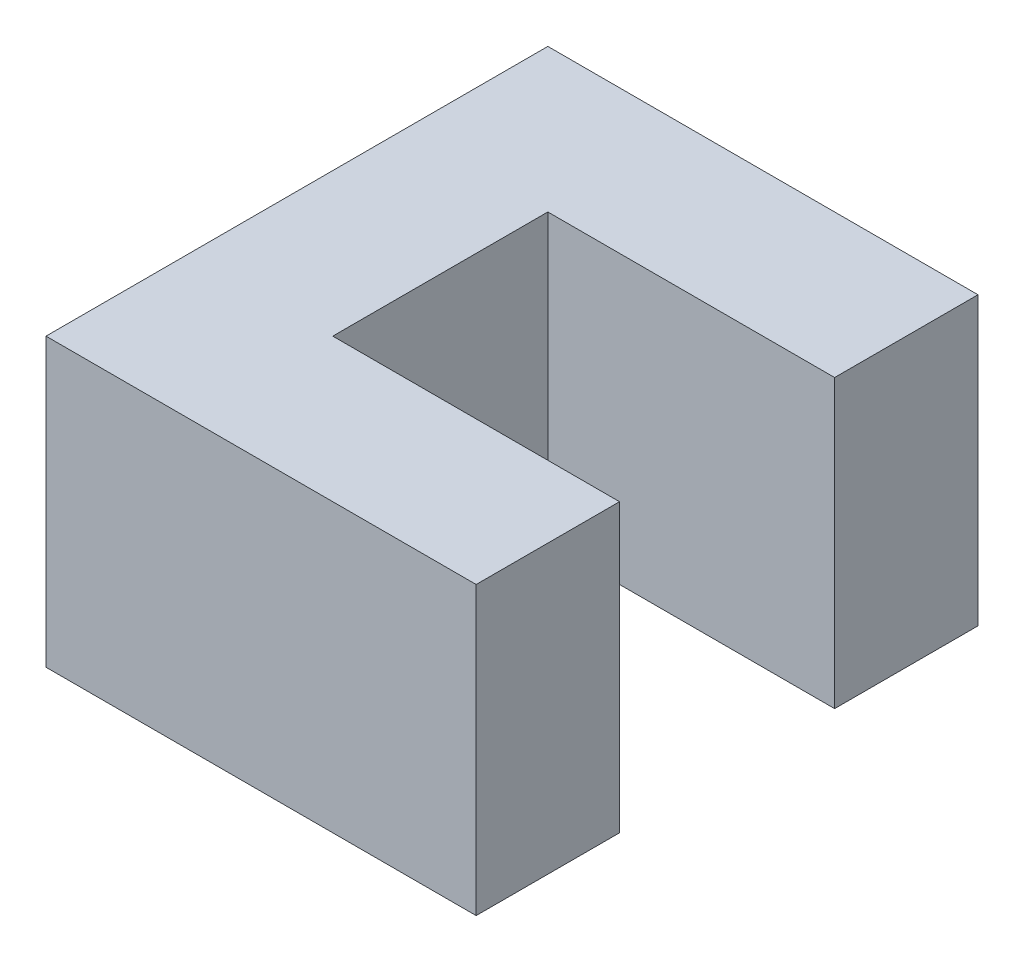
ISO-10303-21;
HEADER;
FILE_DESCRIPTION(('STEP AP214'),'2;1');
FILE_NAME('part.step','',(''),(''),'','','');
FILE_SCHEMA(('AUTOMOTIVE_DESIGN { 1 0 10303 214 1 1 1 1 }'));
ENDSEC;
DATA;
#1=APPLICATION_CONTEXT('core data for automotive mechanical design processes');
#2=APPLICATION_PROTOCOL_DEFINITION('international standard','automotive_design',2000,#1);
#3=PRODUCT_CONTEXT('',#1,'mechanical');
#4=PRODUCT('Part','Part','',(#3));
#5=PRODUCT_RELATED_PRODUCT_CATEGORY('part','',(#4));
#6=PRODUCT_DEFINITION_FORMATION('','',#4);
#7=PRODUCT_DEFINITION_CONTEXT('part definition',#1,'design');
#8=PRODUCT_DEFINITION('design','',#6,#7);
#9=PRODUCT_DEFINITION_SHAPE('','',#8);
#10=(LENGTH_UNIT() NAMED_UNIT(*) SI_UNIT(.MILLI.,.METRE.));
#11=(NAMED_UNIT(*) PLANE_ANGLE_UNIT() SI_UNIT($,.RADIAN.));
#12=(NAMED_UNIT(*) SI_UNIT($,.STERADIAN.) SOLID_ANGLE_UNIT());
#13=UNCERTAINTY_MEASURE_WITH_UNIT(LENGTH_MEASURE(1.E-05),#10,'distance_accuracy_value','');
#14=(GEOMETRIC_REPRESENTATION_CONTEXT(3) GLOBAL_UNCERTAINTY_ASSIGNED_CONTEXT((#13)) GLOBAL_UNIT_ASSIGNED_CONTEXT((#10,
#11,#12)) REPRESENTATION_CONTEXT('',''));
#15=CARTESIAN_POINT('',(0.,0.,0.));
#16=DIRECTION('',(0.,0.,1.));
#17=DIRECTION('',(1.,0.,0.));
#18=AXIS2_PLACEMENT_3D('',#15,#16,#17);
#19=CARTESIAN_POINT('',(30.,20.,0.));
#20=DIRECTION('',(0.,0.,1.));
#21=DIRECTION('',(1.,0.,0.));
#22=AXIS2_PLACEMENT_3D('',#19,#20,#21);
#23=PLANE('',#22);
#24=DIRECTION('',(-1.,0.,0.));
#25=VECTOR('',#24,1.);
#26=CARTESIAN_POINT('',(30.,0.,0.));
#27=LINE('',#26,#25);
#28=CARTESIAN_POINT('',(30.,0.,0.));
#29=VERTEX_POINT('',#28);
#30=CARTESIAN_POINT('',(0.,0.,0.));
#31=VERTEX_POINT('',#30);
#32=EDGE_CURVE('E133',#29,#31,#27,.T.);
#33=ORIENTED_EDGE('',*,*,#32,.T.);
#34=DIRECTION('',(0.,-1.,0.));
#35=VECTOR('',#34,1.);
#36=CARTESIAN_POINT('',(0.,20.,0.));
#37=LINE('',#36,#35);
#38=CARTESIAN_POINT('',(0.,20.,0.));
#39=VERTEX_POINT('',#38);
#40=EDGE_CURVE('E11',#39,#31,#37,.T.);
#41=ORIENTED_EDGE('',*,*,#40,.F.);
#42=DIRECTION('',(-1.,0.,0.));
#43=VECTOR('',#42,1.);
#44=CARTESIAN_POINT('',(30.,20.,0.));
#45=LINE('',#44,#43);
#46=CARTESIAN_POINT('',(30.,20.,0.));
#47=VERTEX_POINT('',#46);
#48=EDGE_CURVE('E147',#47,#39,#45,.T.);
#49=ORIENTED_EDGE('',*,*,#48,.F.);
#50=DIRECTION('',(0.,-1.,0.));
#51=VECTOR('',#50,1.);
#52=CARTESIAN_POINT('',(30.,20.,0.));
#53=LINE('',#52,#51);
#54=EDGE_CURVE('E129',#47,#29,#53,.T.);
#55=ORIENTED_EDGE('',*,*,#54,.T.);
#56=EDGE_LOOP('',(#33,#41,#49,#55));
#57=FACE_BOUND('',#56,.T.);
#58=ADVANCED_FACE('F37',(#57),#23,.F.);
#59=CARTESIAN_POINT('',(0.,20.,0.));
#60=DIRECTION('',(1.,0.,0.));
#61=DIRECTION('',(0.,0.,-1.));
#62=AXIS2_PLACEMENT_3D('',#59,#60,#61);
#63=PLANE('',#62);
#64=DIRECTION('',(0.,0.,1.));
#65=VECTOR('',#64,1.);
#66=CARTESIAN_POINT('',(0.,0.,0.));
#67=LINE('',#66,#65);
#68=CARTESIAN_POINT('',(0.,0.,35.));
#69=VERTEX_POINT('',#68);
#70=EDGE_CURVE('E136',#31,#69,#67,.T.);
#71=ORIENTED_EDGE('',*,*,#70,.T.);
#72=DIRECTION('',(0.,-1.,0.));
#73=VECTOR('',#72,1.);
#74=CARTESIAN_POINT('',(0.,20.,35.));
#75=LINE('',#74,#73);
#76=CARTESIAN_POINT('',(0.,20.,35.));
#77=VERTEX_POINT('',#76);
#78=EDGE_CURVE('E45',#77,#69,#75,.T.);
#79=ORIENTED_EDGE('',*,*,#78,.F.);
#80=DIRECTION('',(0.,0.,1.));
#81=VECTOR('',#80,1.);
#82=CARTESIAN_POINT('',(0.,20.,0.));
#83=LINE('',#82,#81);
#84=EDGE_CURVE('E96',#39,#77,#83,.T.);
#85=ORIENTED_EDGE('',*,*,#84,.F.);
#86=ORIENTED_EDGE('',*,*,#40,.T.);
#87=EDGE_LOOP('',(#71,#79,#85,#86));
#88=FACE_BOUND('',#87,.T.);
#89=ADVANCED_FACE('F182',(#88),#63,.F.);
#90=CARTESIAN_POINT('',(0.,20.,35.));
#91=DIRECTION('',(0.,0.,-1.));
#92=DIRECTION('',(-1.,0.,0.));
#93=AXIS2_PLACEMENT_3D('',#90,#91,#92);
#94=PLANE('',#93);
#95=DIRECTION('',(1.,0.,0.));
#96=VECTOR('',#95,1.);
#97=CARTESIAN_POINT('',(0.,0.,35.));
#98=LINE('',#97,#96);
#99=CARTESIAN_POINT('',(30.,0.,35.));
#100=VERTEX_POINT('',#99);
#101=EDGE_CURVE('E138',#69,#100,#98,.T.);
#102=ORIENTED_EDGE('',*,*,#101,.T.);
#103=DIRECTION('',(0.,-1.,0.));
#104=VECTOR('',#103,1.);
#105=CARTESIAN_POINT('',(30.,20.,35.));
#106=LINE('',#105,#104);
#107=CARTESIAN_POINT('',(30.,20.,35.));
#108=VERTEX_POINT('',#107);
#109=EDGE_CURVE('E154',#108,#100,#106,.T.);
#110=ORIENTED_EDGE('',*,*,#109,.F.);
#111=DIRECTION('',(1.,0.,0.));
#112=VECTOR('',#111,1.);
#113=CARTESIAN_POINT('',(0.,20.,35.));
#114=LINE('',#113,#112);
#115=EDGE_CURVE('E162',#77,#108,#114,.T.);
#116=ORIENTED_EDGE('',*,*,#115,.F.);
#117=ORIENTED_EDGE('',*,*,#78,.T.);
#118=EDGE_LOOP('',(#102,#110,#116,#117));
#119=FACE_BOUND('',#118,.T.);
#120=ADVANCED_FACE('F160',(#119),#94,.F.);
#121=CARTESIAN_POINT('',(30.,20.,35.));
#122=DIRECTION('',(-1.,0.,0.));
#123=DIRECTION('',(0.,0.,1.));
#124=AXIS2_PLACEMENT_3D('',#121,#122,#123);
#125=PLANE('',#124);
#126=DIRECTION('',(0.,0.,-1.));
#127=VECTOR('',#126,1.);
#128=CARTESIAN_POINT('',(30.,0.,35.));
#129=LINE('',#128,#127);
#130=CARTESIAN_POINT('',(30.,0.,25.));
#131=VERTEX_POINT('',#130);
#132=EDGE_CURVE('E140',#100,#131,#129,.T.);
#133=ORIENTED_EDGE('',*,*,#132,.T.);
#134=DIRECTION('',(0.,-1.,0.));
#135=VECTOR('',#134,1.);
#136=CARTESIAN_POINT('',(30.,20.,25.));
#137=LINE('',#136,#135);
#138=CARTESIAN_POINT('',(30.,20.,25.));
#139=VERTEX_POINT('',#138);
#140=EDGE_CURVE('E151',#139,#131,#137,.T.);
#141=ORIENTED_EDGE('',*,*,#140,.F.);
#142=DIRECTION('',(0.,0.,-1.));
#143=VECTOR('',#142,1.);
#144=CARTESIAN_POINT('',(30.,20.,35.));
#145=LINE('',#144,#143);
#146=EDGE_CURVE('E174',#108,#139,#145,.T.);
#147=ORIENTED_EDGE('',*,*,#146,.F.);
#148=ORIENTED_EDGE('',*,*,#109,.T.);
#149=EDGE_LOOP('',(#133,#141,#147,#148));
#150=FACE_BOUND('',#149,.T.);
#151=ADVANCED_FACE('F170',(#150),#125,.F.);
#152=CARTESIAN_POINT('',(30.,20.,25.));
#153=DIRECTION('',(0.,0.,1.));
#154=DIRECTION('',(1.,0.,0.));
#155=AXIS2_PLACEMENT_3D('',#152,#153,#154);
#156=PLANE('',#155);
#157=DIRECTION('',(-1.,0.,0.));
#158=VECTOR('',#157,1.);
#159=CARTESIAN_POINT('',(30.,0.,25.));
#160=LINE('',#159,#158);
#161=CARTESIAN_POINT('',(10.,0.,25.));
#162=VERTEX_POINT('',#161);
#163=EDGE_CURVE('E142',#131,#162,#160,.T.);
#164=ORIENTED_EDGE('',*,*,#163,.T.);
#165=DIRECTION('',(0.,-1.,0.));
#166=VECTOR('',#165,1.);
#167=CARTESIAN_POINT('',(10.,20.,25.));
#168=LINE('',#167,#166);
#169=CARTESIAN_POINT('',(10.,20.,25.));
#170=VERTEX_POINT('',#169);
#171=EDGE_CURVE('E124',#170,#162,#168,.T.);
#172=ORIENTED_EDGE('',*,*,#171,.F.);
#173=DIRECTION('',(-1.,0.,0.));
#174=VECTOR('',#173,1.);
#175=CARTESIAN_POINT('',(30.,20.,25.));
#176=LINE('',#175,#174);
#177=EDGE_CURVE('E115',#139,#170,#176,.T.);
#178=ORIENTED_EDGE('',*,*,#177,.F.);
#179=ORIENTED_EDGE('',*,*,#140,.T.);
#180=EDGE_LOOP('',(#164,#172,#178,#179));
#181=FACE_BOUND('',#180,.T.);
#182=ADVANCED_FACE('F173',(#181),#156,.F.);
#183=CARTESIAN_POINT('',(10.,20.,25.));
#184=DIRECTION('',(-1.,0.,0.));
#185=DIRECTION('',(0.,0.,1.));
#186=AXIS2_PLACEMENT_3D('',#183,#184,#185);
#187=PLANE('',#186);
#188=DIRECTION('',(0.,0.,-1.));
#189=VECTOR('',#188,1.);
#190=CARTESIAN_POINT('',(10.,0.,25.));
#191=LINE('',#190,#189);
#192=CARTESIAN_POINT('',(10.,0.,10.));
#193=VERTEX_POINT('',#192);
#194=EDGE_CURVE('E123',#162,#193,#191,.T.);
#195=ORIENTED_EDGE('',*,*,#194,.T.);
#196=DIRECTION('',(0.,-1.,0.));
#197=VECTOR('',#196,1.);
#198=CARTESIAN_POINT('',(10.,20.,10.));
#199=LINE('',#198,#197);
#200=CARTESIAN_POINT('',(10.,20.,10.));
#201=VERTEX_POINT('',#200);
#202=EDGE_CURVE('E120',#201,#193,#199,.T.);
#203=ORIENTED_EDGE('',*,*,#202,.F.);
#204=DIRECTION('',(0.,0.,-1.));
#205=VECTOR('',#204,1.);
#206=CARTESIAN_POINT('',(10.,20.,25.));
#207=LINE('',#206,#205);
#208=EDGE_CURVE('E109',#170,#201,#207,.T.);
#209=ORIENTED_EDGE('',*,*,#208,.F.);
#210=ORIENTED_EDGE('',*,*,#171,.T.);
#211=EDGE_LOOP('',(#195,#203,#209,#210));
#212=FACE_BOUND('',#211,.T.);
#213=ADVANCED_FACE('F121',(#212),#187,.F.);
#214=CARTESIAN_POINT('',(10.,20.,10.));
#215=DIRECTION('',(0.,0.,-1.));
#216=DIRECTION('',(-1.,0.,0.));
#217=AXIS2_PLACEMENT_3D('',#214,#215,#216);
#218=PLANE('',#217);
#219=DIRECTION('',(1.,0.,0.));
#220=VECTOR('',#219,1.);
#221=CARTESIAN_POINT('',(10.,0.,10.));
#222=LINE('',#221,#220);
#223=CARTESIAN_POINT('',(30.,0.,10.));
#224=VERTEX_POINT('',#223);
#225=EDGE_CURVE('E82',#193,#224,#222,.T.);
#226=ORIENTED_EDGE('',*,*,#225,.T.);
#227=DIRECTION('',(0.,-1.,0.));
#228=VECTOR('',#227,1.);
#229=CARTESIAN_POINT('',(30.,20.,10.));
#230=LINE('',#229,#228);
#231=CARTESIAN_POINT('',(30.,20.,10.));
#232=VERTEX_POINT('',#231);
#233=EDGE_CURVE('E125',#232,#224,#230,.T.);
#234=ORIENTED_EDGE('',*,*,#233,.F.);
#235=DIRECTION('',(1.,0.,0.));
#236=VECTOR('',#235,1.);
#237=CARTESIAN_POINT('',(10.,20.,10.));
#238=LINE('',#237,#236);
#239=EDGE_CURVE('E113',#201,#232,#238,.T.);
#240=ORIENTED_EDGE('',*,*,#239,.F.);
#241=ORIENTED_EDGE('',*,*,#202,.T.);
#242=EDGE_LOOP('',(#226,#234,#240,#241));
#243=FACE_BOUND('',#242,.T.);
#244=ADVANCED_FACE('F127',(#243),#218,.F.);
#245=CARTESIAN_POINT('',(30.,20.,10.));
#246=DIRECTION('',(-1.,0.,0.));
#247=DIRECTION('',(0.,0.,1.));
#248=AXIS2_PLACEMENT_3D('',#245,#246,#247);
#249=PLANE('',#248);
#250=DIRECTION('',(0.,0.,-1.));
#251=VECTOR('',#250,1.);
#252=CARTESIAN_POINT('',(30.,0.,10.));
#253=LINE('',#252,#251);
#254=EDGE_CURVE('E88',#224,#29,#253,.T.);
#255=ORIENTED_EDGE('',*,*,#254,.T.);
#256=ORIENTED_EDGE('',*,*,#54,.F.);
#257=DIRECTION('',(0.,0.,-1.));
#258=VECTOR('',#257,1.);
#259=CARTESIAN_POINT('',(30.,20.,10.));
#260=LINE('',#259,#258);
#261=EDGE_CURVE('E53',#232,#47,#260,.T.);
#262=ORIENTED_EDGE('',*,*,#261,.F.);
#263=ORIENTED_EDGE('',*,*,#233,.T.);
#264=EDGE_LOOP('',(#255,#256,#262,#263));
#265=FACE_BOUND('',#264,.T.);
#266=ADVANCED_FACE('F198',(#265),#249,.F.);
#267=CARTESIAN_POINT('',(0.,20.,0.));
#268=DIRECTION('',(0.,1.,0.));
#269=DIRECTION('',(0.,0.,1.));
#270=AXIS2_PLACEMENT_3D('',#267,#268,#269);
#271=PLANE('',#270);
#272=ORIENTED_EDGE('',*,*,#48,.T.);
#273=ORIENTED_EDGE('',*,*,#84,.T.);
#274=ORIENTED_EDGE('',*,*,#115,.T.);
#275=ORIENTED_EDGE('',*,*,#146,.T.);
#276=ORIENTED_EDGE('',*,*,#177,.T.);
#277=ORIENTED_EDGE('',*,*,#208,.T.);
#278=ORIENTED_EDGE('',*,*,#239,.T.);
#279=ORIENTED_EDGE('',*,*,#261,.T.);
#280=EDGE_LOOP('',(#272,#273,#274,#275,#276,#277,#278,#279));
#281=FACE_BOUND('',#280,.T.);
#282=ADVANCED_FACE('F111',(#281),#271,.T.);
#283=CARTESIAN_POINT('',(0.,0.,0.));
#284=DIRECTION('',(0.,1.,0.));
#285=DIRECTION('',(0.,0.,1.));
#286=AXIS2_PLACEMENT_3D('',#283,#284,#285);
#287=PLANE('',#286);
#288=ORIENTED_EDGE('',*,*,#32,.F.);
#289=ORIENTED_EDGE('',*,*,#254,.F.);
#290=ORIENTED_EDGE('',*,*,#225,.F.);
#291=ORIENTED_EDGE('',*,*,#194,.F.);
#292=ORIENTED_EDGE('',*,*,#163,.F.);
#293=ORIENTED_EDGE('',*,*,#132,.F.);
#294=ORIENTED_EDGE('',*,*,#101,.F.);
#295=ORIENTED_EDGE('',*,*,#70,.F.);
#296=EDGE_LOOP('',(#288,#289,#290,#291,#292,#293,#294,#295));
#297=FACE_BOUND('',#296,.T.);
#298=ADVANCED_FACE('F166',(#297),#287,.F.);
#299=CLOSED_SHELL('',(#58,#89,#120,#151,#182,#213,#244,#266,#282,#298));
#300=MANIFOLD_SOLID_BREP('B2',#299);
#301=ADVANCED_BREP_SHAPE_REPRESENTATION('',(#18,#300),#14);
#302=SHAPE_DEFINITION_REPRESENTATION(#9,#301);
ENDSEC;
END-ISO-10303-21;
